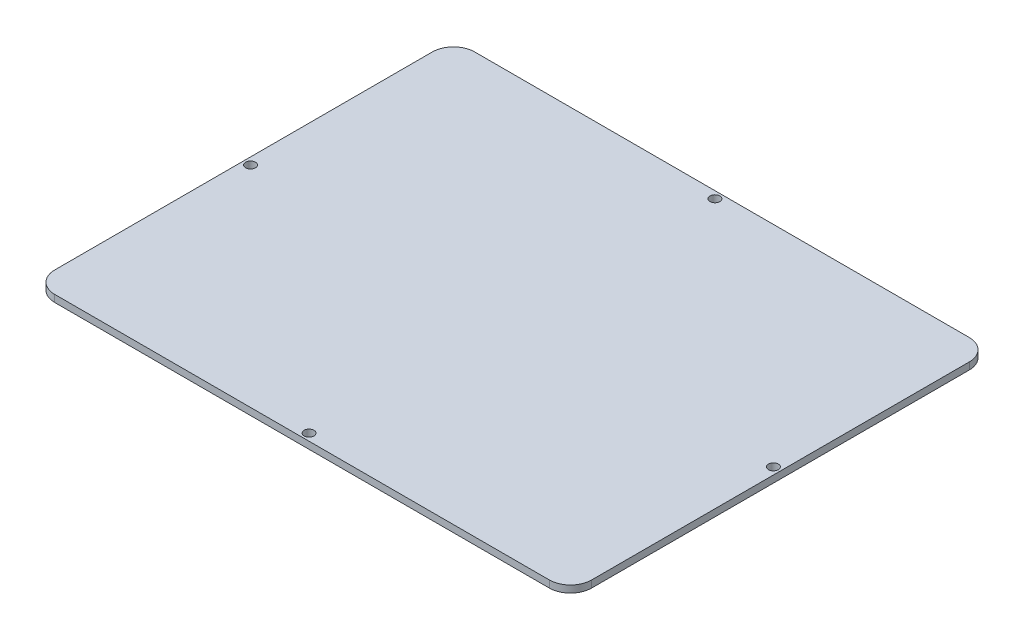
ISO-10303-21;
HEADER;
FILE_DESCRIPTION(('STEP AP214'),'2;1');
FILE_NAME('part.step','',(''),(''),'','','');
FILE_SCHEMA(('AUTOMOTIVE_DESIGN { 1 0 10303 214 1 1 1 1 }'));
ENDSEC;
DATA;
#1=APPLICATION_CONTEXT('core data for automotive mechanical design processes');
#2=APPLICATION_PROTOCOL_DEFINITION('international standard','automotive_design',2000,#1);
#3=PRODUCT_CONTEXT('',#1,'mechanical');
#4=PRODUCT('Part','Part','',(#3));
#5=PRODUCT_RELATED_PRODUCT_CATEGORY('part','',(#4));
#6=PRODUCT_DEFINITION_FORMATION('','',#4);
#7=PRODUCT_DEFINITION_CONTEXT('part definition',#1,'design');
#8=PRODUCT_DEFINITION('design','',#6,#7);
#9=PRODUCT_DEFINITION_SHAPE('','',#8);
#10=(LENGTH_UNIT() NAMED_UNIT(*) SI_UNIT(.MILLI.,.METRE.));
#11=(NAMED_UNIT(*) PLANE_ANGLE_UNIT() SI_UNIT($,.RADIAN.));
#12=(NAMED_UNIT(*) SI_UNIT($,.STERADIAN.) SOLID_ANGLE_UNIT());
#13=UNCERTAINTY_MEASURE_WITH_UNIT(LENGTH_MEASURE(1.E-05),#10,'distance_accuracy_value','');
#14=(GEOMETRIC_REPRESENTATION_CONTEXT(3) GLOBAL_UNCERTAINTY_ASSIGNED_CONTEXT((#13)) GLOBAL_UNIT_ASSIGNED_CONTEXT((#10,
#11,#12)) REPRESENTATION_CONTEXT('',''));
#15=CARTESIAN_POINT('',(0.,0.,0.));
#16=DIRECTION('',(0.,0.,1.));
#17=DIRECTION('',(1.,0.,0.));
#18=AXIS2_PLACEMENT_3D('',#15,#16,#17);
#19=CARTESIAN_POINT('',(70.2000000000001,2.,-53.6));
#20=DIRECTION('',(0.,1.,0.));
#21=DIRECTION('',(0.,0.,1.));
#22=AXIS2_PLACEMENT_3D('',#19,#20,#21);
#23=PLANE('',#22);
#24=CARTESIAN_POINT('',(0.,2.,-57.5999999999998));
#25=DIRECTION('',(0.,1.,0.));
#26=DIRECTION('',(0.,0.,1.));
#27=AXIS2_PLACEMENT_3D('',#24,#25,#26);
#28=CIRCLE('',#27,1.4);
#29=CARTESIAN_POINT('',(0.,2.,-56.1999999999998));
#30=VERTEX_POINT('',#29);
#31=EDGE_CURVE('E203',#30,#30,#28,.T.);
#32=ORIENTED_EDGE('',*,*,#31,.F.);
#33=EDGE_LOOP('',(#32));
#34=FACE_BOUND('',#33,.T.);
#35=CARTESIAN_POINT('',(0.,2.,57.5999999999998));
#36=DIRECTION('',(0.,1.,0.));
#37=DIRECTION('',(0.,0.,1.));
#38=AXIS2_PLACEMENT_3D('',#35,#36,#37);
#39=CIRCLE('',#38,1.4);
#40=CARTESIAN_POINT('',(0.,2.,58.9999999999998));
#41=VERTEX_POINT('',#40);
#42=EDGE_CURVE('E144',#41,#41,#39,.T.);
#43=ORIENTED_EDGE('',*,*,#42,.F.);
#44=EDGE_LOOP('',(#43));
#45=FACE_BOUND('',#44,.T.);
#46=CARTESIAN_POINT('',(70.2000000000001,2.,-53.6));
#47=DIRECTION('',(0.,1.,0.));
#48=DIRECTION('',(0.,0.,1.));
#49=AXIS2_PLACEMENT_3D('',#46,#47,#48);
#50=CIRCLE('',#49,5.99999999999998);
#51=CARTESIAN_POINT('',(76.2,2.,-53.6));
#52=VERTEX_POINT('',#51);
#53=CARTESIAN_POINT('',(70.2000000000001,2.,-59.5999999999999));
#54=VERTEX_POINT('',#53);
#55=EDGE_CURVE('E157',#52,#54,#50,.T.);
#56=ORIENTED_EDGE('',*,*,#55,.T.);
#57=DIRECTION('',(-1.,0.,0.));
#58=VECTOR('',#57,1.);
#59=CARTESIAN_POINT('',(70.2000000000001,2.,-59.5999999999999));
#60=LINE('',#59,#58);
#61=CARTESIAN_POINT('',(-70.2,2.,-59.5999999999999));
#62=VERTEX_POINT('',#61);
#63=EDGE_CURVE('E101',#54,#62,#60,.T.);
#64=ORIENTED_EDGE('',*,*,#63,.T.);
#65=CARTESIAN_POINT('',(-70.2000000000001,2.,-53.6));
#66=DIRECTION('',(0.,1.,0.));
#67=DIRECTION('',(0.,0.,1.));
#68=AXIS2_PLACEMENT_3D('',#65,#66,#67);
#69=CIRCLE('',#68,5.99999999999998);
#70=CARTESIAN_POINT('',(-76.2,2.,-53.6));
#71=VERTEX_POINT('',#70);
#72=EDGE_CURVE('E172',#62,#71,#69,.T.);
#73=ORIENTED_EDGE('',*,*,#72,.T.);
#74=DIRECTION('',(0.,0.,1.));
#75=VECTOR('',#74,1.);
#76=CARTESIAN_POINT('',(-76.2,2.,-53.6));
#77=LINE('',#76,#75);
#78=CARTESIAN_POINT('',(-76.2,2.,53.6));
#79=VERTEX_POINT('',#78);
#80=EDGE_CURVE('E185',#71,#79,#77,.T.);
#81=ORIENTED_EDGE('',*,*,#80,.T.);
#82=CARTESIAN_POINT('',(-70.2,2.,53.6));
#83=DIRECTION('',(0.,1.,0.));
#84=DIRECTION('',(0.,0.,1.));
#85=AXIS2_PLACEMENT_3D('',#82,#83,#84);
#86=CIRCLE('',#85,6.00000000000001);
#87=CARTESIAN_POINT('',(-70.2,2.,59.6));
#88=VERTEX_POINT('',#87);
#89=EDGE_CURVE('E120',#79,#88,#86,.T.);
#90=ORIENTED_EDGE('',*,*,#89,.T.);
#91=DIRECTION('',(1.,0.,0.));
#92=VECTOR('',#91,1.);
#93=CARTESIAN_POINT('',(-70.2,2.,59.6));
#94=LINE('',#93,#92);
#95=CARTESIAN_POINT('',(70.2,2.,59.6));
#96=VERTEX_POINT('',#95);
#97=EDGE_CURVE('E114',#88,#96,#94,.T.);
#98=ORIENTED_EDGE('',*,*,#97,.T.);
#99=CARTESIAN_POINT('',(70.2,2.,53.6));
#100=DIRECTION('',(0.,1.,0.));
#101=DIRECTION('',(0.,0.,1.));
#102=AXIS2_PLACEMENT_3D('',#99,#100,#101);
#103=CIRCLE('',#102,6.00000000000001);
#104=CARTESIAN_POINT('',(76.2,2.,53.6));
#105=VERTEX_POINT('',#104);
#106=EDGE_CURVE('E118',#96,#105,#103,.T.);
#107=ORIENTED_EDGE('',*,*,#106,.T.);
#108=DIRECTION('',(0.,0.,-1.));
#109=VECTOR('',#108,1.);
#110=CARTESIAN_POINT('',(76.2,2.,53.6));
#111=LINE('',#110,#109);
#112=EDGE_CURVE('E58',#105,#52,#111,.T.);
#113=ORIENTED_EDGE('',*,*,#112,.T.);
#114=EDGE_LOOP('',(#56,#64,#73,#81,#90,#98,#107,#113));
#115=FACE_BOUND('',#114,.T.);
#116=CARTESIAN_POINT('',(74.2,2.,0.));
#117=DIRECTION('',(0.,1.,0.));
#118=DIRECTION('',(0.,0.,1.));
#119=AXIS2_PLACEMENT_3D('',#116,#117,#118);
#120=CIRCLE('',#119,1.4);
#121=CARTESIAN_POINT('',(74.2,2.,1.4));
#122=VERTEX_POINT('',#121);
#123=EDGE_CURVE('E195',#122,#122,#120,.T.);
#124=ORIENTED_EDGE('',*,*,#123,.F.);
#125=EDGE_LOOP('',(#124));
#126=FACE_BOUND('',#125,.T.);
#127=CARTESIAN_POINT('',(-74.2,2.,0.));
#128=DIRECTION('',(0.,1.,0.));
#129=DIRECTION('',(0.,0.,1.));
#130=AXIS2_PLACEMENT_3D('',#127,#128,#129);
#131=CIRCLE('',#130,1.4);
#132=CARTESIAN_POINT('',(-74.2,2.,1.4));
#133=VERTEX_POINT('',#132);
#134=EDGE_CURVE('E210',#133,#133,#131,.T.);
#135=ORIENTED_EDGE('',*,*,#134,.F.);
#136=EDGE_LOOP('',(#135));
#137=FACE_BOUND('',#136,.T.);
#138=ADVANCED_FACE('F41',(#34,#45,#115,#126,#137),#23,.T.);
#139=CARTESIAN_POINT('',(70.2000000000001,0.,-53.6));
#140=DIRECTION('',(0.,1.,0.));
#141=DIRECTION('',(0.,0.,1.));
#142=AXIS2_PLACEMENT_3D('',#139,#140,#141);
#143=PLANE('',#142);
#144=CARTESIAN_POINT('',(70.2000000000001,0.,-53.6));
#145=DIRECTION('',(0.,1.,0.));
#146=DIRECTION('',(0.,0.,1.));
#147=AXIS2_PLACEMENT_3D('',#144,#145,#146);
#148=CIRCLE('',#147,5.99999999999998);
#149=CARTESIAN_POINT('',(76.2,0.,-53.6));
#150=VERTEX_POINT('',#149);
#151=CARTESIAN_POINT('',(70.2000000000001,0.,-59.5999999999999));
#152=VERTEX_POINT('',#151);
#153=EDGE_CURVE('E140',#150,#152,#148,.T.);
#154=ORIENTED_EDGE('',*,*,#153,.F.);
#155=DIRECTION('',(0.,0.,-1.));
#156=VECTOR('',#155,1.);
#157=CARTESIAN_POINT('',(76.2,0.,53.6));
#158=LINE('',#157,#156);
#159=CARTESIAN_POINT('',(76.2,0.,53.6));
#160=VERTEX_POINT('',#159);
#161=EDGE_CURVE('E93',#160,#150,#158,.T.);
#162=ORIENTED_EDGE('',*,*,#161,.F.);
#163=CARTESIAN_POINT('',(70.2,0.,53.6));
#164=DIRECTION('',(0.,1.,0.));
#165=DIRECTION('',(0.,0.,1.));
#166=AXIS2_PLACEMENT_3D('',#163,#164,#165);
#167=CIRCLE('',#166,6.00000000000001);
#168=CARTESIAN_POINT('',(70.2,0.,59.6));
#169=VERTEX_POINT('',#168);
#170=EDGE_CURVE('E87',#169,#160,#167,.T.);
#171=ORIENTED_EDGE('',*,*,#170,.F.);
#172=DIRECTION('',(1.,0.,0.));
#173=VECTOR('',#172,1.);
#174=CARTESIAN_POINT('',(-70.2,0.,59.6));
#175=LINE('',#174,#173);
#176=CARTESIAN_POINT('',(-70.2,0.,59.6));
#177=VERTEX_POINT('',#176);
#178=EDGE_CURVE('E129',#177,#169,#175,.T.);
#179=ORIENTED_EDGE('',*,*,#178,.F.);
#180=CARTESIAN_POINT('',(-70.2,0.,53.6));
#181=DIRECTION('',(0.,1.,0.));
#182=DIRECTION('',(0.,0.,1.));
#183=AXIS2_PLACEMENT_3D('',#180,#181,#182);
#184=CIRCLE('',#183,6.00000000000001);
#185=CARTESIAN_POINT('',(-76.2,0.,53.6));
#186=VERTEX_POINT('',#185);
#187=EDGE_CURVE('E150',#186,#177,#184,.T.);
#188=ORIENTED_EDGE('',*,*,#187,.F.);
#189=DIRECTION('',(0.,0.,1.));
#190=VECTOR('',#189,1.);
#191=CARTESIAN_POINT('',(-76.2,0.,-53.6));
#192=LINE('',#191,#190);
#193=CARTESIAN_POINT('',(-76.2,0.,-53.6));
#194=VERTEX_POINT('',#193);
#195=EDGE_CURVE('E148',#194,#186,#192,.T.);
#196=ORIENTED_EDGE('',*,*,#195,.F.);
#197=CARTESIAN_POINT('',(-70.2000000000001,0.,-53.6));
#198=DIRECTION('',(0.,1.,0.));
#199=DIRECTION('',(0.,0.,1.));
#200=AXIS2_PLACEMENT_3D('',#197,#198,#199);
#201=CIRCLE('',#200,5.99999999999998);
#202=CARTESIAN_POINT('',(-70.2,0.,-59.5999999999999));
#203=VERTEX_POINT('',#202);
#204=EDGE_CURVE('E146',#203,#194,#201,.T.);
#205=ORIENTED_EDGE('',*,*,#204,.F.);
#206=DIRECTION('',(-1.,0.,0.));
#207=VECTOR('',#206,1.);
#208=CARTESIAN_POINT('',(70.2000000000001,0.,-59.5999999999999));
#209=LINE('',#208,#207);
#210=EDGE_CURVE('E143',#152,#203,#209,.T.);
#211=ORIENTED_EDGE('',*,*,#210,.F.);
#212=EDGE_LOOP('',(#154,#162,#171,#179,#188,#196,#205,#211));
#213=FACE_BOUND('',#212,.T.);
#214=CARTESIAN_POINT('',(0.,0.,57.5999999999998));
#215=DIRECTION('',(0.,1.,0.));
#216=DIRECTION('',(0.,0.,1.));
#217=AXIS2_PLACEMENT_3D('',#214,#215,#216);
#218=CIRCLE('',#217,1.4);
#219=CARTESIAN_POINT('',(0.,0.,58.9999999999998));
#220=VERTEX_POINT('',#219);
#221=EDGE_CURVE('E191',#220,#220,#218,.T.);
#222=ORIENTED_EDGE('',*,*,#221,.T.);
#223=EDGE_LOOP('',(#222));
#224=FACE_BOUND('',#223,.T.);
#225=CARTESIAN_POINT('',(74.2,0.,0.));
#226=DIRECTION('',(0.,1.,0.));
#227=DIRECTION('',(0.,0.,1.));
#228=AXIS2_PLACEMENT_3D('',#225,#226,#227);
#229=CIRCLE('',#228,1.4);
#230=CARTESIAN_POINT('',(74.2,0.,1.4));
#231=VERTEX_POINT('',#230);
#232=EDGE_CURVE('E199',#231,#231,#229,.T.);
#233=ORIENTED_EDGE('',*,*,#232,.T.);
#234=EDGE_LOOP('',(#233));
#235=FACE_BOUND('',#234,.T.);
#236=CARTESIAN_POINT('',(0.,0.,-57.5999999999998));
#237=DIRECTION('',(0.,1.,0.));
#238=DIRECTION('',(0.,0.,1.));
#239=AXIS2_PLACEMENT_3D('',#236,#237,#238);
#240=CIRCLE('',#239,1.4);
#241=CARTESIAN_POINT('',(0.,0.,-56.1999999999998));
#242=VERTEX_POINT('',#241);
#243=EDGE_CURVE('E207',#242,#242,#240,.T.);
#244=ORIENTED_EDGE('',*,*,#243,.T.);
#245=EDGE_LOOP('',(#244));
#246=FACE_BOUND('',#245,.T.);
#247=CARTESIAN_POINT('',(-74.2,0.,0.));
#248=DIRECTION('',(0.,1.,0.));
#249=DIRECTION('',(0.,0.,1.));
#250=AXIS2_PLACEMENT_3D('',#247,#248,#249);
#251=CIRCLE('',#250,1.4);
#252=CARTESIAN_POINT('',(-74.2,0.,1.4));
#253=VERTEX_POINT('',#252);
#254=EDGE_CURVE('E213',#253,#253,#251,.T.);
#255=ORIENTED_EDGE('',*,*,#254,.T.);
#256=EDGE_LOOP('',(#255));
#257=FACE_BOUND('',#256,.T.);
#258=ADVANCED_FACE('F176',(#213,#224,#235,#246,#257),#143,.F.);
#259=CARTESIAN_POINT('',(70.2000000000001,2.,-53.6));
#260=DIRECTION('',(0.,-1.,0.));
#261=DIRECTION('',(0.,0.,-1.));
#262=AXIS2_PLACEMENT_3D('',#259,#260,#261);
#263=CYLINDRICAL_SURFACE('',#262,5.99999999999998);
#264=ORIENTED_EDGE('',*,*,#153,.T.);
#265=DIRECTION('',(0.,-1.,0.));
#266=VECTOR('',#265,1.);
#267=CARTESIAN_POINT('',(70.2000000000001,2.,-59.5999999999999));
#268=LINE('',#267,#266);
#269=EDGE_CURVE('E11',#54,#152,#268,.T.);
#270=ORIENTED_EDGE('',*,*,#269,.F.);
#271=ORIENTED_EDGE('',*,*,#55,.F.);
#272=DIRECTION('',(0.,-1.,0.));
#273=VECTOR('',#272,1.);
#274=CARTESIAN_POINT('',(76.2,2.,-53.6));
#275=LINE('',#274,#273);
#276=EDGE_CURVE('E136',#52,#150,#275,.T.);
#277=ORIENTED_EDGE('',*,*,#276,.T.);
#278=EDGE_LOOP('',(#264,#270,#271,#277));
#279=FACE_BOUND('',#278,.T.);
#280=ADVANCED_FACE('F43',(#279),#263,.T.);
#281=CARTESIAN_POINT('',(70.2000000000001,2.,-59.5999999999999));
#282=DIRECTION('',(0.,0.,1.));
#283=DIRECTION('',(1.,0.,0.));
#284=AXIS2_PLACEMENT_3D('',#281,#282,#283);
#285=PLANE('',#284);
#286=ORIENTED_EDGE('',*,*,#210,.T.);
#287=DIRECTION('',(0.,-1.,0.));
#288=VECTOR('',#287,1.);
#289=CARTESIAN_POINT('',(-70.2,2.,-59.5999999999999));
#290=LINE('',#289,#288);
#291=EDGE_CURVE('E50',#62,#203,#290,.T.);
#292=ORIENTED_EDGE('',*,*,#291,.F.);
#293=ORIENTED_EDGE('',*,*,#63,.F.);
#294=ORIENTED_EDGE('',*,*,#269,.T.);
#295=EDGE_LOOP('',(#286,#292,#293,#294));
#296=FACE_BOUND('',#295,.T.);
#297=ADVANCED_FACE('F247',(#296),#285,.F.);
#298=CARTESIAN_POINT('',(-70.2000000000001,2.,-53.6));
#299=DIRECTION('',(0.,-1.,0.));
#300=DIRECTION('',(0.,0.,-1.));
#301=AXIS2_PLACEMENT_3D('',#298,#299,#300);
#302=CYLINDRICAL_SURFACE('',#301,5.99999999999998);
#303=ORIENTED_EDGE('',*,*,#204,.T.);
#304=DIRECTION('',(0.,-1.,0.));
#305=VECTOR('',#304,1.);
#306=CARTESIAN_POINT('',(-76.2,2.,-53.6));
#307=LINE('',#306,#305);
#308=EDGE_CURVE('E164',#71,#194,#307,.T.);
#309=ORIENTED_EDGE('',*,*,#308,.F.);
#310=ORIENTED_EDGE('',*,*,#72,.F.);
#311=ORIENTED_EDGE('',*,*,#291,.T.);
#312=EDGE_LOOP('',(#303,#309,#310,#311));
#313=FACE_BOUND('',#312,.T.);
#314=ADVANCED_FACE('F170',(#313),#302,.T.);
#315=CARTESIAN_POINT('',(-76.2,2.,-53.6));
#316=DIRECTION('',(1.,0.,0.));
#317=DIRECTION('',(0.,0.,-1.));
#318=AXIS2_PLACEMENT_3D('',#315,#316,#317);
#319=PLANE('',#318);
#320=ORIENTED_EDGE('',*,*,#195,.T.);
#321=DIRECTION('',(0.,-1.,0.));
#322=VECTOR('',#321,1.);
#323=CARTESIAN_POINT('',(-76.2,2.,53.6));
#324=LINE('',#323,#322);
#325=EDGE_CURVE('E161',#79,#186,#324,.T.);
#326=ORIENTED_EDGE('',*,*,#325,.F.);
#327=ORIENTED_EDGE('',*,*,#80,.F.);
#328=ORIENTED_EDGE('',*,*,#308,.T.);
#329=EDGE_LOOP('',(#320,#326,#327,#328));
#330=FACE_BOUND('',#329,.T.);
#331=ADVANCED_FACE('F181',(#330),#319,.F.);
#332=CARTESIAN_POINT('',(-70.2,2.,53.6));
#333=DIRECTION('',(0.,-1.,0.));
#334=DIRECTION('',(0.,0.,-1.));
#335=AXIS2_PLACEMENT_3D('',#332,#333,#334);
#336=CYLINDRICAL_SURFACE('',#335,6.00000000000001);
#337=ORIENTED_EDGE('',*,*,#187,.T.);
#338=DIRECTION('',(0.,-1.,0.));
#339=VECTOR('',#338,1.);
#340=CARTESIAN_POINT('',(-70.2,2.,59.6));
#341=LINE('',#340,#339);
#342=EDGE_CURVE('E130',#88,#177,#341,.T.);
#343=ORIENTED_EDGE('',*,*,#342,.F.);
#344=ORIENTED_EDGE('',*,*,#89,.F.);
#345=ORIENTED_EDGE('',*,*,#325,.T.);
#346=EDGE_LOOP('',(#337,#343,#344,#345));
#347=FACE_BOUND('',#346,.T.);
#348=ADVANCED_FACE('F184',(#347),#336,.T.);
#349=CARTESIAN_POINT('',(-70.2,2.,59.6));
#350=DIRECTION('',(0.,0.,-1.));
#351=DIRECTION('',(-1.,0.,0.));
#352=AXIS2_PLACEMENT_3D('',#349,#350,#351);
#353=PLANE('',#352);
#354=ORIENTED_EDGE('',*,*,#178,.T.);
#355=DIRECTION('',(0.,-1.,0.));
#356=VECTOR('',#355,1.);
#357=CARTESIAN_POINT('',(70.2,2.,59.6));
#358=LINE('',#357,#356);
#359=EDGE_CURVE('E126',#96,#169,#358,.T.);
#360=ORIENTED_EDGE('',*,*,#359,.F.);
#361=ORIENTED_EDGE('',*,*,#97,.F.);
#362=ORIENTED_EDGE('',*,*,#342,.T.);
#363=EDGE_LOOP('',(#354,#360,#361,#362));
#364=FACE_BOUND('',#363,.T.);
#365=ADVANCED_FACE('F127',(#364),#353,.F.);
#366=CARTESIAN_POINT('',(70.2,2.,53.6));
#367=DIRECTION('',(0.,-1.,0.));
#368=DIRECTION('',(0.,0.,-1.));
#369=AXIS2_PLACEMENT_3D('',#366,#367,#368);
#370=CYLINDRICAL_SURFACE('',#369,6.00000000000001);
#371=ORIENTED_EDGE('',*,*,#170,.T.);
#372=DIRECTION('',(0.,-1.,0.));
#373=VECTOR('',#372,1.);
#374=CARTESIAN_POINT('',(76.2,2.,53.6));
#375=LINE('',#374,#373);
#376=EDGE_CURVE('E131',#105,#160,#375,.T.);
#377=ORIENTED_EDGE('',*,*,#376,.F.);
#378=ORIENTED_EDGE('',*,*,#106,.F.);
#379=ORIENTED_EDGE('',*,*,#359,.T.);
#380=EDGE_LOOP('',(#371,#377,#378,#379));
#381=FACE_BOUND('',#380,.T.);
#382=ADVANCED_FACE('F133',(#381),#370,.T.);
#383=CARTESIAN_POINT('',(76.2,2.,53.6));
#384=DIRECTION('',(-1.,0.,0.));
#385=DIRECTION('',(0.,0.,1.));
#386=AXIS2_PLACEMENT_3D('',#383,#384,#385);
#387=PLANE('',#386);
#388=ORIENTED_EDGE('',*,*,#161,.T.);
#389=ORIENTED_EDGE('',*,*,#276,.F.);
#390=ORIENTED_EDGE('',*,*,#112,.F.);
#391=ORIENTED_EDGE('',*,*,#376,.T.);
#392=EDGE_LOOP('',(#388,#389,#390,#391));
#393=FACE_BOUND('',#392,.T.);
#394=ADVANCED_FACE('F235',(#393),#387,.F.);
#395=CARTESIAN_POINT('',(0.,2.,57.5999999999998));
#396=DIRECTION('',(0.,-1.,0.));
#397=DIRECTION('',(0.,0.,-1.));
#398=AXIS2_PLACEMENT_3D('',#395,#396,#397);
#399=CYLINDRICAL_SURFACE('',#398,1.4);
#400=ORIENTED_EDGE('',*,*,#42,.T.);
#401=EDGE_LOOP('',(#400));
#402=FACE_BOUND('',#401,.T.);
#403=ORIENTED_EDGE('',*,*,#221,.F.);
#404=EDGE_LOOP('',(#403));
#405=FACE_BOUND('',#404,.T.);
#406=ADVANCED_FACE('F232',(#402,#405),#399,.F.);
#407=CARTESIAN_POINT('',(74.2,2.,0.));
#408=DIRECTION('',(0.,-1.,0.));
#409=DIRECTION('',(0.,0.,-1.));
#410=AXIS2_PLACEMENT_3D('',#407,#408,#409);
#411=CYLINDRICAL_SURFACE('',#410,1.4);
#412=ORIENTED_EDGE('',*,*,#123,.T.);
#413=EDGE_LOOP('',(#412));
#414=FACE_BOUND('',#413,.T.);
#415=ORIENTED_EDGE('',*,*,#232,.F.);
#416=EDGE_LOOP('',(#415));
#417=FACE_BOUND('',#416,.T.);
#418=ADVANCED_FACE('F334',(#414,#417),#411,.F.);
#419=CARTESIAN_POINT('',(0.,2.,-57.5999999999998));
#420=DIRECTION('',(0.,-1.,0.));
#421=DIRECTION('',(0.,0.,-1.));
#422=AXIS2_PLACEMENT_3D('',#419,#420,#421);
#423=CYLINDRICAL_SURFACE('',#422,1.4);
#424=ORIENTED_EDGE('',*,*,#31,.T.);
#425=EDGE_LOOP('',(#424));
#426=FACE_BOUND('',#425,.T.);
#427=ORIENTED_EDGE('',*,*,#243,.F.);
#428=EDGE_LOOP('',(#427));
#429=FACE_BOUND('',#428,.T.);
#430=ADVANCED_FACE('F344',(#426,#429),#423,.F.);
#431=CARTESIAN_POINT('',(-74.2,2.,0.));
#432=DIRECTION('',(0.,-1.,0.));
#433=DIRECTION('',(0.,0.,-1.));
#434=AXIS2_PLACEMENT_3D('',#431,#432,#433);
#435=CYLINDRICAL_SURFACE('',#434,1.4);
#436=ORIENTED_EDGE('',*,*,#134,.T.);
#437=EDGE_LOOP('',(#436));
#438=FACE_BOUND('',#437,.T.);
#439=ORIENTED_EDGE('',*,*,#254,.F.);
#440=EDGE_LOOP('',(#439));
#441=FACE_BOUND('',#440,.T.);
#442=ADVANCED_FACE('F219',(#438,#441),#435,.F.);
#443=CLOSED_SHELL('',(#138,#258,#280,#297,#314,#331,#348,#365,#382,#394,#406,#418,#430,#442));
#444=MANIFOLD_SOLID_BREP('B2',#443);
#445=ADVANCED_BREP_SHAPE_REPRESENTATION('',(#18,#444),#14);
#446=SHAPE_DEFINITION_REPRESENTATION(#9,#445);
ENDSEC;
END-ISO-10303-21;
